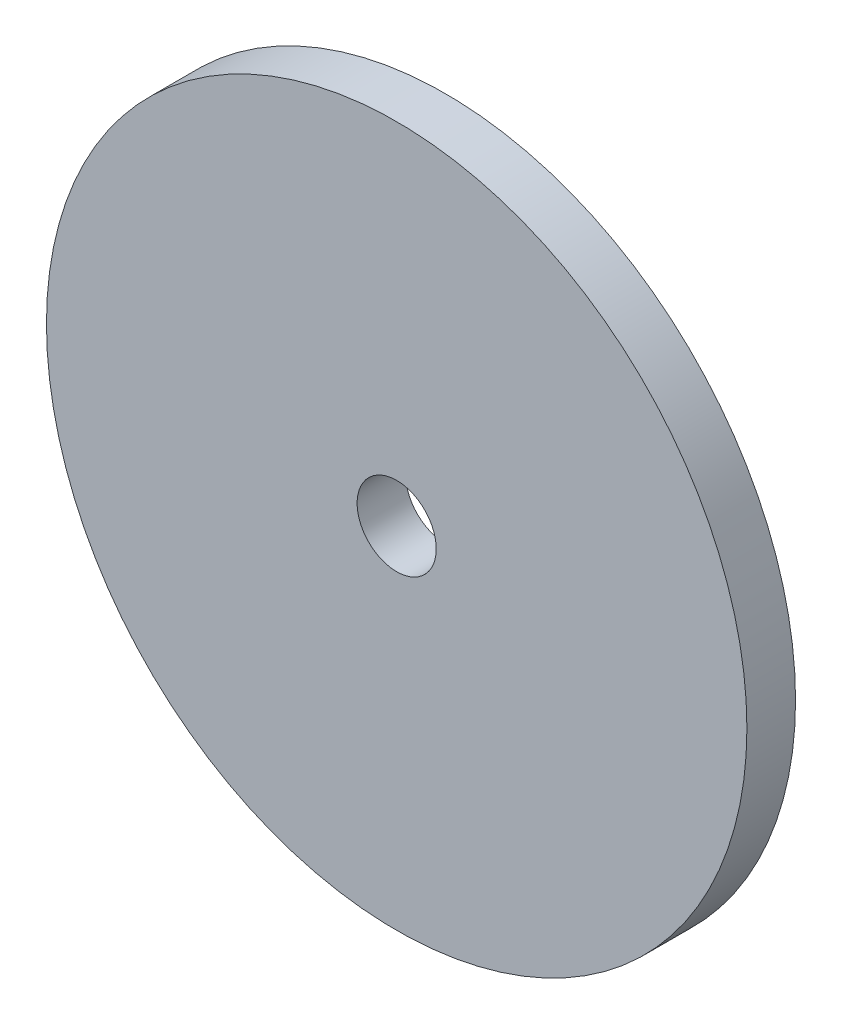
ISO-10303-21;
HEADER;
FILE_DESCRIPTION(('STEP AP214'),'2;1');
FILE_NAME('part.step','',(''),(''),'','','');
FILE_SCHEMA(('AUTOMOTIVE_DESIGN { 1 0 10303 214 1 1 1 1 }'));
ENDSEC;
DATA;
#1=APPLICATION_CONTEXT('core data for automotive mechanical design processes');
#2=APPLICATION_PROTOCOL_DEFINITION('international standard','automotive_design',2000,#1);
#3=PRODUCT_CONTEXT('',#1,'mechanical');
#4=PRODUCT('Part','Part','',(#3));
#5=PRODUCT_RELATED_PRODUCT_CATEGORY('part','',(#4));
#6=PRODUCT_DEFINITION_FORMATION('','',#4);
#7=PRODUCT_DEFINITION_CONTEXT('part definition',#1,'design');
#8=PRODUCT_DEFINITION('design','',#6,#7);
#9=PRODUCT_DEFINITION_SHAPE('','',#8);
#10=(LENGTH_UNIT() NAMED_UNIT(*) SI_UNIT(.MILLI.,.METRE.));
#11=(NAMED_UNIT(*) PLANE_ANGLE_UNIT() SI_UNIT($,.RADIAN.));
#12=(NAMED_UNIT(*) SI_UNIT($,.STERADIAN.) SOLID_ANGLE_UNIT());
#13=UNCERTAINTY_MEASURE_WITH_UNIT(LENGTH_MEASURE(1.E-05),#10,'distance_accuracy_value','');
#14=(GEOMETRIC_REPRESENTATION_CONTEXT(3) GLOBAL_UNCERTAINTY_ASSIGNED_CONTEXT((#13)) GLOBAL_UNIT_ASSIGNED_CONTEXT((#10,
#11,#12)) REPRESENTATION_CONTEXT('',''));
#15=CARTESIAN_POINT('',(0.,0.,0.));
#16=DIRECTION('',(0.,0.,1.));
#17=DIRECTION('',(1.,0.,0.));
#18=AXIS2_PLACEMENT_3D('',#15,#16,#17);
#19=CARTESIAN_POINT('',(-72.3348449074024,41.07755868597,3.175));
#20=DIRECTION('',(0.,0.,1.));
#21=DIRECTION('',(1.,0.,0.));
#22=AXIS2_PLACEMENT_3D('',#19,#20,#21);
#23=PLANE('',#22);
#24=CARTESIAN_POINT('',(-72.3348449074024,41.07755868597,3.175));
#25=DIRECTION('',(0.,0.,1.));
#26=DIRECTION('',(1.,0.,0.));
#27=AXIS2_PLACEMENT_3D('',#24,#25,#26);
#28=CIRCLE('',#27,22.86);
#29=CARTESIAN_POINT('',(-49.4748449074024,41.07755868597,3.175));
#30=VERTEX_POINT('',#29);
#31=EDGE_CURVE('E10',#30,#30,#28,.T.);
#32=ORIENTED_EDGE('',*,*,#31,.T.);
#33=EDGE_LOOP('',(#32));
#34=FACE_BOUND('',#33,.T.);
#35=CARTESIAN_POINT('',(-72.3348449074024,41.07755868597,3.175));
#36=DIRECTION('',(0.,0.,1.));
#37=DIRECTION('',(1.,0.,0.));
#38=AXIS2_PLACEMENT_3D('',#35,#36,#37);
#39=CIRCLE('',#38,2.5828);
#40=CARTESIAN_POINT('',(-69.7520449074024,41.07755868597,3.175));
#41=VERTEX_POINT('',#40);
#42=EDGE_CURVE('E42',#41,#41,#39,.T.);
#43=ORIENTED_EDGE('',*,*,#42,.F.);
#44=EDGE_LOOP('',(#43));
#45=FACE_BOUND('',#44,.T.);
#46=ADVANCED_FACE('F31',(#34,#45),#23,.T.);
#47=CARTESIAN_POINT('',(-72.3348449074024,41.07755868597,0.));
#48=DIRECTION('',(0.,0.,1.));
#49=DIRECTION('',(1.,0.,0.));
#50=AXIS2_PLACEMENT_3D('',#47,#48,#49);
#51=PLANE('',#50);
#52=CARTESIAN_POINT('',(-72.3348449074024,41.07755868597,0.));
#53=DIRECTION('',(0.,0.,1.));
#54=DIRECTION('',(1.,0.,0.));
#55=AXIS2_PLACEMENT_3D('',#52,#53,#54);
#56=CIRCLE('',#55,22.86);
#57=CARTESIAN_POINT('',(-49.4748449074024,41.07755868597,0.));
#58=VERTEX_POINT('',#57);
#59=EDGE_CURVE('E35',#58,#58,#56,.T.);
#60=ORIENTED_EDGE('',*,*,#59,.F.);
#61=EDGE_LOOP('',(#60));
#62=FACE_BOUND('',#61,.T.);
#63=CARTESIAN_POINT('',(-72.3348449074024,41.07755868597,0.));
#64=DIRECTION('',(0.,0.,1.));
#65=DIRECTION('',(1.,0.,0.));
#66=AXIS2_PLACEMENT_3D('',#63,#64,#65);
#67=CIRCLE('',#66,2.5828);
#68=CARTESIAN_POINT('',(-69.7520449074024,41.07755868597,0.));
#69=VERTEX_POINT('',#68);
#70=EDGE_CURVE('E44',#69,#69,#67,.T.);
#71=ORIENTED_EDGE('',*,*,#70,.T.);
#72=EDGE_LOOP('',(#71));
#73=FACE_BOUND('',#72,.T.);
#74=ADVANCED_FACE('F54',(#62,#73),#51,.F.);
#75=CARTESIAN_POINT('',(-72.3348449074024,41.07755868597,3.175));
#76=DIRECTION('',(0.,0.,-1.));
#77=DIRECTION('',(-1.,0.,0.));
#78=AXIS2_PLACEMENT_3D('',#75,#76,#77);
#79=CYLINDRICAL_SURFACE('',#78,22.86);
#80=ORIENTED_EDGE('',*,*,#31,.F.);
#81=EDGE_LOOP('',(#80));
#82=FACE_BOUND('',#81,.T.);
#83=ORIENTED_EDGE('',*,*,#59,.T.);
#84=EDGE_LOOP('',(#83));
#85=FACE_BOUND('',#84,.T.);
#86=ADVANCED_FACE('F33',(#82,#85),#79,.T.);
#87=CARTESIAN_POINT('',(-72.3348449074024,41.07755868597,3.175));
#88=DIRECTION('',(0.,0.,-1.));
#89=DIRECTION('',(-1.,0.,0.));
#90=AXIS2_PLACEMENT_3D('',#87,#88,#89);
#91=CYLINDRICAL_SURFACE('',#90,2.5828);
#92=ORIENTED_EDGE('',*,*,#42,.T.);
#93=EDGE_LOOP('',(#92));
#94=FACE_BOUND('',#93,.T.);
#95=ORIENTED_EDGE('',*,*,#70,.F.);
#96=EDGE_LOOP('',(#95));
#97=FACE_BOUND('',#96,.T.);
#98=ADVANCED_FACE('F50',(#94,#97),#91,.F.);
#99=CLOSED_SHELL('',(#46,#74,#86,#98));
#100=MANIFOLD_SOLID_BREP('B2',#99);
#101=ADVANCED_BREP_SHAPE_REPRESENTATION('',(#18,#100),#14);
#102=SHAPE_DEFINITION_REPRESENTATION(#9,#101);
ENDSEC;
END-ISO-10303-21;
